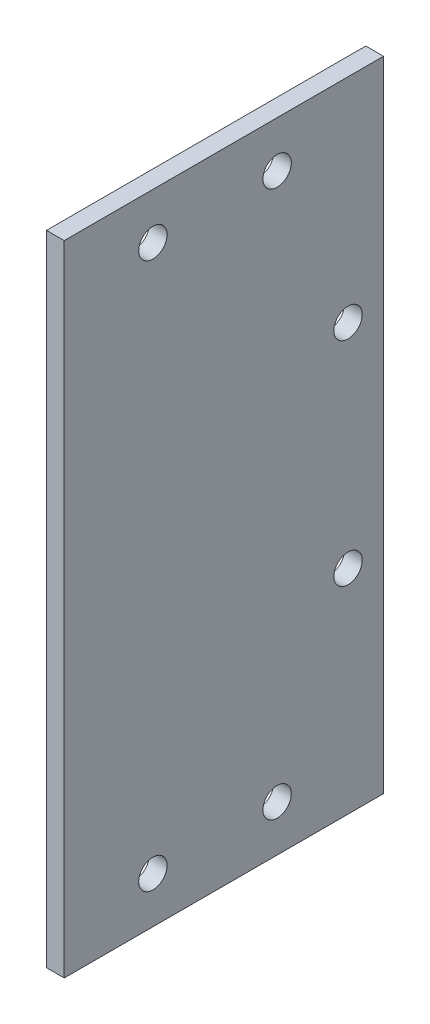
ISO-10303-21;
HEADER;
FILE_DESCRIPTION(('STEP AP214'),'2;1');
FILE_NAME('part.step','',(''),(''),'','','');
FILE_SCHEMA(('AUTOMOTIVE_DESIGN { 1 0 10303 214 1 1 1 1 }'));
ENDSEC;
DATA;
#1=APPLICATION_CONTEXT('core data for automotive mechanical design processes');
#2=APPLICATION_PROTOCOL_DEFINITION('international standard','automotive_design',2000,#1);
#3=PRODUCT_CONTEXT('',#1,'mechanical');
#4=PRODUCT('Part','Part','',(#3));
#5=PRODUCT_RELATED_PRODUCT_CATEGORY('part','',(#4));
#6=PRODUCT_DEFINITION_FORMATION('','',#4);
#7=PRODUCT_DEFINITION_CONTEXT('part definition',#1,'design');
#8=PRODUCT_DEFINITION('design','',#6,#7);
#9=PRODUCT_DEFINITION_SHAPE('','',#8);
#10=(LENGTH_UNIT() NAMED_UNIT(*) SI_UNIT(.MILLI.,.METRE.));
#11=(NAMED_UNIT(*) PLANE_ANGLE_UNIT() SI_UNIT($,.RADIAN.));
#12=(NAMED_UNIT(*) SI_UNIT($,.STERADIAN.) SOLID_ANGLE_UNIT());
#13=UNCERTAINTY_MEASURE_WITH_UNIT(LENGTH_MEASURE(1.E-05),#10,'distance_accuracy_value','');
#14=(GEOMETRIC_REPRESENTATION_CONTEXT(3) GLOBAL_UNCERTAINTY_ASSIGNED_CONTEXT((#13)) GLOBAL_UNIT_ASSIGNED_CONTEXT((#10,
#11,#12)) REPRESENTATION_CONTEXT('',''));
#15=CARTESIAN_POINT('',(0.,0.,0.));
#16=DIRECTION('',(0.,0.,1.));
#17=DIRECTION('',(1.,0.,0.));
#18=AXIS2_PLACEMENT_3D('',#15,#16,#17);
#19=CARTESIAN_POINT('',(5.,0.,0.));
#20=DIRECTION('',(1.,0.,0.));
#21=DIRECTION('',(0.,0.,-1.));
#22=AXIS2_PLACEMENT_3D('',#19,#20,#21);
#23=PLANE('',#22);
#24=CARTESIAN_POINT('',(5.,77.,-15.));
#25=DIRECTION('',(1.,0.,0.));
#26=DIRECTION('',(0.,0.,1.));
#27=AXIS2_PLACEMENT_3D('',#24,#25,#26);
#28=CIRCLE('',#27,4.00000000000001);
#29=CARTESIAN_POINT('',(5.,77.,-11.));
#30=VERTEX_POINT('',#29);
#31=EDGE_CURVE('E164',#30,#30,#28,.T.);
#32=ORIENTED_EDGE('',*,*,#31,.F.);
#33=EDGE_LOOP('',(#32));
#34=FACE_BOUND('',#33,.T.);
#35=CARTESIAN_POINT('',(5.,-30.,-35.));
#36=DIRECTION('',(1.,0.,0.));
#37=DIRECTION('',(0.,0.,-1.));
#38=AXIS2_PLACEMENT_3D('',#35,#36,#37);
#39=CIRCLE('',#38,4.);
#40=CARTESIAN_POINT('',(5.,-30.,-39.));
#41=VERTEX_POINT('',#40);
#42=EDGE_CURVE('E148',#41,#41,#39,.T.);
#43=ORIENTED_EDGE('',*,*,#42,.F.);
#44=EDGE_LOOP('',(#43));
#45=FACE_BOUND('',#44,.T.);
#46=CARTESIAN_POINT('',(5.,-77.,20.));
#47=DIRECTION('',(1.,0.,0.));
#48=DIRECTION('',(0.,0.,-1.));
#49=AXIS2_PLACEMENT_3D('',#46,#47,#48);
#50=CIRCLE('',#49,4.00000000000001);
#51=CARTESIAN_POINT('',(5.,-77.,16.));
#52=VERTEX_POINT('',#51);
#53=EDGE_CURVE('E118',#52,#52,#50,.T.);
#54=ORIENTED_EDGE('',*,*,#53,.F.);
#55=EDGE_LOOP('',(#54));
#56=FACE_BOUND('',#55,.T.);
#57=DIRECTION('',(0.,0.,1.));
#58=VECTOR('',#57,1.);
#59=CARTESIAN_POINT('',(5.,90.,45.));
#60=LINE('',#59,#58);
#61=CARTESIAN_POINT('',(5.,90.,-45.));
#62=VERTEX_POINT('',#61);
#63=CARTESIAN_POINT('',(5.,90.,45.));
#64=VERTEX_POINT('',#63);
#65=EDGE_CURVE('E98',#62,#64,#60,.T.);
#66=ORIENTED_EDGE('',*,*,#65,.T.);
#67=DIRECTION('',(0.,-1.,0.));
#68=VECTOR('',#67,1.);
#69=CARTESIAN_POINT('',(5.,-90.,45.));
#70=LINE('',#69,#68);
#71=CARTESIAN_POINT('',(5.,-90.,45.));
#72=VERTEX_POINT('',#71);
#73=EDGE_CURVE('E93',#64,#72,#70,.T.);
#74=ORIENTED_EDGE('',*,*,#73,.T.);
#75=DIRECTION('',(0.,0.,-1.));
#76=VECTOR('',#75,1.);
#77=CARTESIAN_POINT('',(5.,-90.,45.));
#78=LINE('',#77,#76);
#79=CARTESIAN_POINT('',(5.,-90.,-45.));
#80=VERTEX_POINT('',#79);
#81=EDGE_CURVE('E96',#72,#80,#78,.T.);
#82=ORIENTED_EDGE('',*,*,#81,.T.);
#83=DIRECTION('',(0.,1.,0.));
#84=VECTOR('',#83,1.);
#85=CARTESIAN_POINT('',(5.,-90.,-45.));
#86=LINE('',#85,#84);
#87=EDGE_CURVE('E63',#80,#62,#86,.T.);
#88=ORIENTED_EDGE('',*,*,#87,.T.);
#89=EDGE_LOOP('',(#66,#74,#82,#88));
#90=FACE_BOUND('',#89,.T.);
#91=CARTESIAN_POINT('',(5.,-77.,-15.));
#92=DIRECTION('',(1.,0.,0.));
#93=DIRECTION('',(0.,0.,-1.));
#94=AXIS2_PLACEMENT_3D('',#91,#92,#93);
#95=CIRCLE('',#94,4.00000000000001);
#96=CARTESIAN_POINT('',(5.,-77.,-19.));
#97=VERTEX_POINT('',#96);
#98=EDGE_CURVE('E140',#97,#97,#95,.T.);
#99=ORIENTED_EDGE('',*,*,#98,.F.);
#100=EDGE_LOOP('',(#99));
#101=FACE_BOUND('',#100,.T.);
#102=CARTESIAN_POINT('',(5.,30.,-35.));
#103=DIRECTION('',(1.,0.,0.));
#104=DIRECTION('',(0.,0.,1.));
#105=AXIS2_PLACEMENT_3D('',#102,#103,#104);
#106=CIRCLE('',#105,4.);
#107=CARTESIAN_POINT('',(5.,30.,-31.));
#108=VERTEX_POINT('',#107);
#109=EDGE_CURVE('E156',#108,#108,#106,.T.);
#110=ORIENTED_EDGE('',*,*,#109,.F.);
#111=EDGE_LOOP('',(#110));
#112=FACE_BOUND('',#111,.T.);
#113=CARTESIAN_POINT('',(5.,77.,20.));
#114=DIRECTION('',(1.,0.,0.));
#115=DIRECTION('',(0.,0.,1.));
#116=AXIS2_PLACEMENT_3D('',#113,#114,#115);
#117=CIRCLE('',#116,4.00000000000001);
#118=CARTESIAN_POINT('',(5.,77.,24.));
#119=VERTEX_POINT('',#118);
#120=EDGE_CURVE('E172',#119,#119,#117,.T.);
#121=ORIENTED_EDGE('',*,*,#120,.F.);
#122=EDGE_LOOP('',(#121));
#123=FACE_BOUND('',#122,.T.);
#124=ADVANCED_FACE('F45',(#34,#45,#56,#90,#101,#112,#123),#23,.T.);
#125=CARTESIAN_POINT('',(0.,0.,0.));
#126=DIRECTION('',(1.,0.,0.));
#127=DIRECTION('',(0.,0.,-1.));
#128=AXIS2_PLACEMENT_3D('',#125,#126,#127);
#129=PLANE('',#128);
#130=DIRECTION('',(0.,0.,1.));
#131=VECTOR('',#130,1.);
#132=CARTESIAN_POINT('',(0.,90.,45.));
#133=LINE('',#132,#131);
#134=CARTESIAN_POINT('',(0.,90.,-45.));
#135=VERTEX_POINT('',#134);
#136=CARTESIAN_POINT('',(0.,90.,45.));
#137=VERTEX_POINT('',#136);
#138=EDGE_CURVE('E114',#135,#137,#133,.T.);
#139=ORIENTED_EDGE('',*,*,#138,.F.);
#140=DIRECTION('',(0.,1.,0.));
#141=VECTOR('',#140,1.);
#142=CARTESIAN_POINT('',(0.,-90.,-45.));
#143=LINE('',#142,#141);
#144=CARTESIAN_POINT('',(0.,-90.,-45.));
#145=VERTEX_POINT('',#144);
#146=EDGE_CURVE('E86',#145,#135,#143,.T.);
#147=ORIENTED_EDGE('',*,*,#146,.F.);
#148=DIRECTION('',(0.,0.,-1.));
#149=VECTOR('',#148,1.);
#150=CARTESIAN_POINT('',(0.,-90.,45.));
#151=LINE('',#150,#149);
#152=CARTESIAN_POINT('',(0.,-90.,45.));
#153=VERTEX_POINT('',#152);
#154=EDGE_CURVE('E80',#153,#145,#151,.T.);
#155=ORIENTED_EDGE('',*,*,#154,.F.);
#156=DIRECTION('',(0.,-1.,0.));
#157=VECTOR('',#156,1.);
#158=CARTESIAN_POINT('',(0.,-90.,45.));
#159=LINE('',#158,#157);
#160=EDGE_CURVE('E103',#137,#153,#159,.T.);
#161=ORIENTED_EDGE('',*,*,#160,.F.);
#162=EDGE_LOOP('',(#139,#147,#155,#161));
#163=FACE_BOUND('',#162,.T.);
#164=CARTESIAN_POINT('',(0.,-77.,20.));
#165=DIRECTION('',(1.,0.,0.));
#166=DIRECTION('',(0.,0.,-1.));
#167=AXIS2_PLACEMENT_3D('',#164,#165,#166);
#168=CIRCLE('',#167,4.00000000000001);
#169=CARTESIAN_POINT('',(0.,-77.,16.));
#170=VERTEX_POINT('',#169);
#171=EDGE_CURVE('E136',#170,#170,#168,.T.);
#172=ORIENTED_EDGE('',*,*,#171,.T.);
#173=EDGE_LOOP('',(#172));
#174=FACE_BOUND('',#173,.T.);
#175=CARTESIAN_POINT('',(0.,-77.,-15.));
#176=DIRECTION('',(1.,0.,0.));
#177=DIRECTION('',(0.,0.,-1.));
#178=AXIS2_PLACEMENT_3D('',#175,#176,#177);
#179=CIRCLE('',#178,4.00000000000001);
#180=CARTESIAN_POINT('',(0.,-77.,-19.));
#181=VERTEX_POINT('',#180);
#182=EDGE_CURVE('E144',#181,#181,#179,.T.);
#183=ORIENTED_EDGE('',*,*,#182,.T.);
#184=EDGE_LOOP('',(#183));
#185=FACE_BOUND('',#184,.T.);
#186=CARTESIAN_POINT('',(0.,-30.,-35.));
#187=DIRECTION('',(1.,0.,0.));
#188=DIRECTION('',(0.,0.,-1.));
#189=AXIS2_PLACEMENT_3D('',#186,#187,#188);
#190=CIRCLE('',#189,4.);
#191=CARTESIAN_POINT('',(0.,-30.,-39.));
#192=VERTEX_POINT('',#191);
#193=EDGE_CURVE('E152',#192,#192,#190,.T.);
#194=ORIENTED_EDGE('',*,*,#193,.T.);
#195=EDGE_LOOP('',(#194));
#196=FACE_BOUND('',#195,.T.);
#197=CARTESIAN_POINT('',(0.,30.,-35.));
#198=DIRECTION('',(1.,0.,0.));
#199=DIRECTION('',(0.,0.,1.));
#200=AXIS2_PLACEMENT_3D('',#197,#198,#199);
#201=CIRCLE('',#200,4.);
#202=CARTESIAN_POINT('',(0.,30.,-31.));
#203=VERTEX_POINT('',#202);
#204=EDGE_CURVE('E160',#203,#203,#201,.T.);
#205=ORIENTED_EDGE('',*,*,#204,.T.);
#206=EDGE_LOOP('',(#205));
#207=FACE_BOUND('',#206,.T.);
#208=CARTESIAN_POINT('',(0.,77.,-15.));
#209=DIRECTION('',(1.,0.,0.));
#210=DIRECTION('',(0.,0.,1.));
#211=AXIS2_PLACEMENT_3D('',#208,#209,#210);
#212=CIRCLE('',#211,4.00000000000001);
#213=CARTESIAN_POINT('',(0.,77.,-11.));
#214=VERTEX_POINT('',#213);
#215=EDGE_CURVE('E168',#214,#214,#212,.T.);
#216=ORIENTED_EDGE('',*,*,#215,.T.);
#217=EDGE_LOOP('',(#216));
#218=FACE_BOUND('',#217,.T.);
#219=CARTESIAN_POINT('',(0.,77.,20.));
#220=DIRECTION('',(1.,0.,0.));
#221=DIRECTION('',(0.,0.,1.));
#222=AXIS2_PLACEMENT_3D('',#219,#220,#221);
#223=CIRCLE('',#222,4.00000000000001);
#224=CARTESIAN_POINT('',(0.,77.,24.));
#225=VERTEX_POINT('',#224);
#226=EDGE_CURVE('E176',#225,#225,#223,.T.);
#227=ORIENTED_EDGE('',*,*,#226,.T.);
#228=EDGE_LOOP('',(#227));
#229=FACE_BOUND('',#228,.T.);
#230=ADVANCED_FACE('F131',(#163,#174,#185,#196,#207,#218,#229),#129,.F.);
#231=CARTESIAN_POINT('',(5.,90.,45.));
#232=DIRECTION('',(0.,-1.,0.));
#233=DIRECTION('',(0.,0.,-1.));
#234=AXIS2_PLACEMENT_3D('',#231,#232,#233);
#235=PLANE('',#234);
#236=ORIENTED_EDGE('',*,*,#138,.T.);
#237=DIRECTION('',(-1.,0.,0.));
#238=VECTOR('',#237,1.);
#239=CARTESIAN_POINT('',(5.,90.,45.));
#240=LINE('',#239,#238);
#241=EDGE_CURVE('E11',#64,#137,#240,.T.);
#242=ORIENTED_EDGE('',*,*,#241,.F.);
#243=ORIENTED_EDGE('',*,*,#65,.F.);
#244=DIRECTION('',(-1.,0.,0.));
#245=VECTOR('',#244,1.);
#246=CARTESIAN_POINT('',(5.,90.,-45.));
#247=LINE('',#246,#245);
#248=EDGE_CURVE('E110',#62,#135,#247,.T.);
#249=ORIENTED_EDGE('',*,*,#248,.T.);
#250=EDGE_LOOP('',(#236,#242,#243,#249));
#251=FACE_BOUND('',#250,.T.);
#252=ADVANCED_FACE('F47',(#251),#235,.F.);
#253=CARTESIAN_POINT('',(5.,-90.,45.));
#254=DIRECTION('',(0.,0.,-1.));
#255=DIRECTION('',(-1.,0.,0.));
#256=AXIS2_PLACEMENT_3D('',#253,#254,#255);
#257=PLANE('',#256);
#258=ORIENTED_EDGE('',*,*,#160,.T.);
#259=DIRECTION('',(-1.,0.,0.));
#260=VECTOR('',#259,1.);
#261=CARTESIAN_POINT('',(5.,-90.,45.));
#262=LINE('',#261,#260);
#263=EDGE_CURVE('E55',#72,#153,#262,.T.);
#264=ORIENTED_EDGE('',*,*,#263,.F.);
#265=ORIENTED_EDGE('',*,*,#73,.F.);
#266=ORIENTED_EDGE('',*,*,#241,.T.);
#267=EDGE_LOOP('',(#258,#264,#265,#266));
#268=FACE_BOUND('',#267,.T.);
#269=ADVANCED_FACE('F102',(#268),#257,.F.);
#270=CARTESIAN_POINT('',(5.,-90.,45.));
#271=DIRECTION('',(0.,1.,0.));
#272=DIRECTION('',(0.,0.,1.));
#273=AXIS2_PLACEMENT_3D('',#270,#271,#272);
#274=PLANE('',#273);
#275=ORIENTED_EDGE('',*,*,#154,.T.);
#276=DIRECTION('',(-1.,0.,0.));
#277=VECTOR('',#276,1.);
#278=CARTESIAN_POINT('',(5.,-90.,-45.));
#279=LINE('',#278,#277);
#280=EDGE_CURVE('E105',#80,#145,#279,.T.);
#281=ORIENTED_EDGE('',*,*,#280,.F.);
#282=ORIENTED_EDGE('',*,*,#81,.F.);
#283=ORIENTED_EDGE('',*,*,#263,.T.);
#284=EDGE_LOOP('',(#275,#281,#282,#283));
#285=FACE_BOUND('',#284,.T.);
#286=ADVANCED_FACE('F106',(#285),#274,.F.);
#287=CARTESIAN_POINT('',(5.,-90.,-45.));
#288=DIRECTION('',(0.,0.,1.));
#289=DIRECTION('',(1.,0.,0.));
#290=AXIS2_PLACEMENT_3D('',#287,#288,#289);
#291=PLANE('',#290);
#292=ORIENTED_EDGE('',*,*,#146,.T.);
#293=ORIENTED_EDGE('',*,*,#248,.F.);
#294=ORIENTED_EDGE('',*,*,#87,.F.);
#295=ORIENTED_EDGE('',*,*,#280,.T.);
#296=EDGE_LOOP('',(#292,#293,#294,#295));
#297=FACE_BOUND('',#296,.T.);
#298=ADVANCED_FACE('F128',(#297),#291,.F.);
#299=CARTESIAN_POINT('',(5.,-77.,20.));
#300=DIRECTION('',(-1.,0.,0.));
#301=DIRECTION('',(0.,0.,1.));
#302=AXIS2_PLACEMENT_3D('',#299,#300,#301);
#303=CYLINDRICAL_SURFACE('',#302,4.00000000000001);
#304=ORIENTED_EDGE('',*,*,#53,.T.);
#305=EDGE_LOOP('',(#304));
#306=FACE_BOUND('',#305,.T.);
#307=ORIENTED_EDGE('',*,*,#171,.F.);
#308=EDGE_LOOP('',(#307));
#309=FACE_BOUND('',#308,.T.);
#310=ADVANCED_FACE('F197',(#306,#309),#303,.F.);
#311=CARTESIAN_POINT('',(5.,-77.,-15.));
#312=DIRECTION('',(-1.,0.,0.));
#313=DIRECTION('',(0.,0.,1.));
#314=AXIS2_PLACEMENT_3D('',#311,#312,#313);
#315=CYLINDRICAL_SURFACE('',#314,4.00000000000001);
#316=ORIENTED_EDGE('',*,*,#98,.T.);
#317=EDGE_LOOP('',(#316));
#318=FACE_BOUND('',#317,.T.);
#319=ORIENTED_EDGE('',*,*,#182,.F.);
#320=EDGE_LOOP('',(#319));
#321=FACE_BOUND('',#320,.T.);
#322=ADVANCED_FACE('F242',(#318,#321),#315,.F.);
#323=CARTESIAN_POINT('',(5.,-30.,-35.));
#324=DIRECTION('',(-1.,0.,0.));
#325=DIRECTION('',(0.,0.,1.));
#326=AXIS2_PLACEMENT_3D('',#323,#324,#325);
#327=CYLINDRICAL_SURFACE('',#326,4.);
#328=ORIENTED_EDGE('',*,*,#42,.T.);
#329=EDGE_LOOP('',(#328));
#330=FACE_BOUND('',#329,.T.);
#331=ORIENTED_EDGE('',*,*,#193,.F.);
#332=EDGE_LOOP('',(#331));
#333=FACE_BOUND('',#332,.T.);
#334=ADVANCED_FACE('F250',(#330,#333),#327,.F.);
#335=CARTESIAN_POINT('',(5.,30.,-35.));
#336=DIRECTION('',(-1.,0.,0.));
#337=DIRECTION('',(0.,0.,1.));
#338=AXIS2_PLACEMENT_3D('',#335,#336,#337);
#339=CYLINDRICAL_SURFACE('',#338,4.);
#340=ORIENTED_EDGE('',*,*,#109,.T.);
#341=EDGE_LOOP('',(#340));
#342=FACE_BOUND('',#341,.T.);
#343=ORIENTED_EDGE('',*,*,#204,.F.);
#344=EDGE_LOOP('',(#343));
#345=FACE_BOUND('',#344,.T.);
#346=ADVANCED_FACE('F258',(#342,#345),#339,.F.);
#347=CARTESIAN_POINT('',(5.,77.,-15.));
#348=DIRECTION('',(-1.,0.,0.));
#349=DIRECTION('',(0.,0.,1.));
#350=AXIS2_PLACEMENT_3D('',#347,#348,#349);
#351=CYLINDRICAL_SURFACE('',#350,4.00000000000001);
#352=ORIENTED_EDGE('',*,*,#31,.T.);
#353=EDGE_LOOP('',(#352));
#354=FACE_BOUND('',#353,.T.);
#355=ORIENTED_EDGE('',*,*,#215,.F.);
#356=EDGE_LOOP('',(#355));
#357=FACE_BOUND('',#356,.T.);
#358=ADVANCED_FACE('F267',(#354,#357),#351,.F.);
#359=CARTESIAN_POINT('',(5.,77.,20.));
#360=DIRECTION('',(-1.,0.,0.));
#361=DIRECTION('',(0.,0.,1.));
#362=AXIS2_PLACEMENT_3D('',#359,#360,#361);
#363=CYLINDRICAL_SURFACE('',#362,4.00000000000001);
#364=ORIENTED_EDGE('',*,*,#120,.T.);
#365=EDGE_LOOP('',(#364));
#366=FACE_BOUND('',#365,.T.);
#367=ORIENTED_EDGE('',*,*,#226,.F.);
#368=EDGE_LOOP('',(#367));
#369=FACE_BOUND('',#368,.T.);
#370=ADVANCED_FACE('F184',(#366,#369),#363,.F.);
#371=CLOSED_SHELL('',(#124,#230,#252,#269,#286,#298,#310,#322,#334,#346,#358,#370));
#372=MANIFOLD_SOLID_BREP('B2',#371);
#373=ADVANCED_BREP_SHAPE_REPRESENTATION('',(#18,#372),#14);
#374=SHAPE_DEFINITION_REPRESENTATION(#9,#373);
ENDSEC;
END-ISO-10303-21;
